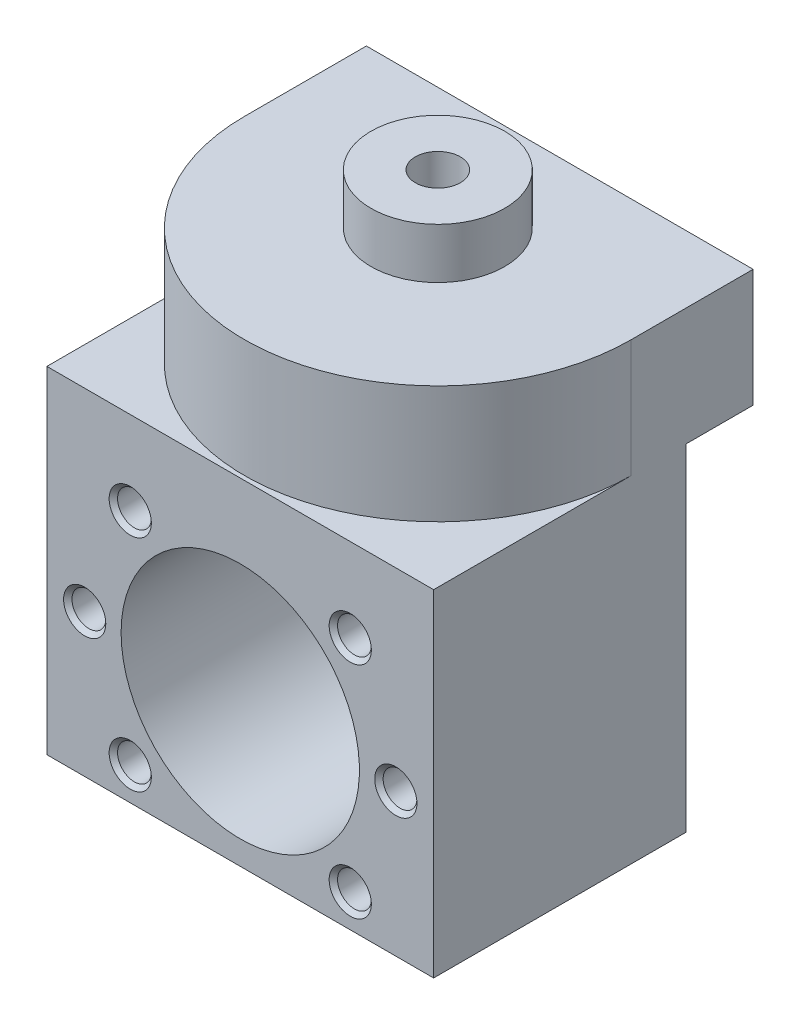
ISO-10303-21;
HEADER;
FILE_DESCRIPTION(('STEP AP214'),'2;1');
FILE_NAME('part.step','',(''),(''),'','','');
FILE_SCHEMA(('AUTOMOTIVE_DESIGN { 1 0 10303 214 1 1 1 1 }'));
ENDSEC;
DATA;
#1=APPLICATION_CONTEXT('core data for automotive mechanical design processes');
#2=APPLICATION_PROTOCOL_DEFINITION('international standard','automotive_design',2000,#1);
#3=PRODUCT_CONTEXT('',#1,'mechanical');
#4=PRODUCT('Part','Part','',(#3));
#5=PRODUCT_RELATED_PRODUCT_CATEGORY('part','',(#4));
#6=PRODUCT_DEFINITION_FORMATION('','',#4);
#7=PRODUCT_DEFINITION_CONTEXT('part definition',#1,'design');
#8=PRODUCT_DEFINITION('design','',#6,#7);
#9=PRODUCT_DEFINITION_SHAPE('','',#8);
#10=(LENGTH_UNIT() NAMED_UNIT(*) SI_UNIT(.MILLI.,.METRE.));
#11=(NAMED_UNIT(*) PLANE_ANGLE_UNIT() SI_UNIT($,.RADIAN.));
#12=(NAMED_UNIT(*) SI_UNIT($,.STERADIAN.) SOLID_ANGLE_UNIT());
#13=UNCERTAINTY_MEASURE_WITH_UNIT(LENGTH_MEASURE(1.E-05),#10,'distance_accuracy_value','');
#14=(GEOMETRIC_REPRESENTATION_CONTEXT(3) GLOBAL_UNCERTAINTY_ASSIGNED_CONTEXT((#13)) GLOBAL_UNIT_ASSIGNED_CONTEXT((#10,
#11,#12)) REPRESENTATION_CONTEXT('',''));
#15=CARTESIAN_POINT('',(0.,0.,0.));
#16=DIRECTION('',(0.,0.,1.));
#17=DIRECTION('',(1.,0.,0.));
#18=AXIS2_PLACEMENT_3D('',#15,#16,#17);
#19=CARTESIAN_POINT('',(0.,68.58,-10.795));
#20=DIRECTION('',(0.,1.,0.));
#21=DIRECTION('',(0.,0.,1.));
#22=AXIS2_PLACEMENT_3D('',#19,#20,#21);
#23=PLANE('',#22);
#24=CARTESIAN_POINT('',(0.,68.58,-10.795));
#25=DIRECTION('',(0.,1.,0.));
#26=DIRECTION('',(0.,0.,1.));
#27=AXIS2_PLACEMENT_3D('',#24,#25,#26);
#28=CIRCLE('',#27,29.21);
#29=CARTESIAN_POINT('',(-29.21,68.58,-10.795));
#30=VERTEX_POINT('',#29);
#31=CARTESIAN_POINT('',(29.21,68.58,-10.795));
#32=VERTEX_POINT('',#31);
#33=EDGE_CURVE('E139',#30,#32,#28,.T.);
#34=ORIENTED_EDGE('',*,*,#33,.T.);
#35=DIRECTION('',(0.,0.,-1.));
#36=VECTOR('',#35,1.);
#37=CARTESIAN_POINT('',(29.21,68.58,-29.21));
#38=LINE('',#37,#36);
#39=CARTESIAN_POINT('',(29.21,68.58,-29.21));
#40=VERTEX_POINT('',#39);
#41=EDGE_CURVE('E141',#32,#40,#38,.T.);
#42=ORIENTED_EDGE('',*,*,#41,.T.);
#43=DIRECTION('',(-1.,0.,0.));
#44=VECTOR('',#43,1.);
#45=CARTESIAN_POINT('',(-29.21,68.58,-29.21));
#46=LINE('',#45,#44);
#47=CARTESIAN_POINT('',(-29.21,68.58,-29.21));
#48=VERTEX_POINT('',#47);
#49=EDGE_CURVE('E144',#40,#48,#46,.T.);
#50=ORIENTED_EDGE('',*,*,#49,.T.);
#51=DIRECTION('',(0.,0.,1.));
#52=VECTOR('',#51,1.);
#53=CARTESIAN_POINT('',(-29.21,68.58,-29.21));
#54=LINE('',#53,#52);
#55=EDGE_CURVE('E146',#48,#30,#54,.T.);
#56=ORIENTED_EDGE('',*,*,#55,.T.);
#57=EDGE_LOOP('',(#34,#42,#50,#56));
#58=FACE_BOUND('',#57,.T.);
#59=CARTESIAN_POINT('',(0.,68.58,-10.795));
#60=DIRECTION('',(0.,1.,0.));
#61=DIRECTION('',(0.,0.,1.));
#62=AXIS2_PLACEMENT_3D('',#59,#60,#61);
#63=CIRCLE('',#62,10.0965);
#64=CARTESIAN_POINT('',(0.,68.58,-20.8915));
#65=VERTEX_POINT('',#64);
#66=EDGE_CURVE('E136',#65,#65,#63,.T.);
#67=ORIENTED_EDGE('',*,*,#66,.F.);
#68=EDGE_LOOP('',(#67));
#69=FACE_BOUND('',#68,.T.);
#70=ADVANCED_FACE('F37',(#58,#69),#23,.T.);
#71=CARTESIAN_POINT('',(29.21,50.8,-19.05));
#72=DIRECTION('',(-1.,0.,0.));
#73=DIRECTION('',(0.,0.,1.));
#74=AXIS2_PLACEMENT_3D('',#71,#72,#73);
#75=PLANE('',#74);
#76=DIRECTION('',(0.,0.,-1.));
#77=VECTOR('',#76,1.);
#78=CARTESIAN_POINT('',(29.21,0.,-19.05));
#79=LINE('',#78,#77);
#80=CARTESIAN_POINT('',(29.21,0.,19.05));
#81=VERTEX_POINT('',#80);
#82=CARTESIAN_POINT('',(29.21,0.,-19.05));
#83=VERTEX_POINT('',#82);
#84=EDGE_CURVE('E163',#81,#83,#79,.T.);
#85=ORIENTED_EDGE('',*,*,#84,.T.);
#86=DIRECTION('',(0.,-1.,0.));
#87=VECTOR('',#86,1.);
#88=CARTESIAN_POINT('',(29.21,50.8,-19.05));
#89=LINE('',#88,#87);
#90=CARTESIAN_POINT('',(29.21,50.8,-19.05));
#91=VERTEX_POINT('',#90);
#92=EDGE_CURVE('E11',#91,#83,#89,.T.);
#93=ORIENTED_EDGE('',*,*,#92,.F.);
#94=DIRECTION('',(0.,0.,-1.));
#95=VECTOR('',#94,1.);
#96=CARTESIAN_POINT('',(29.21,50.8,-29.21));
#97=LINE('',#96,#95);
#98=CARTESIAN_POINT('',(29.21,50.8,-29.21));
#99=VERTEX_POINT('',#98);
#100=EDGE_CURVE('E156',#91,#99,#97,.T.);
#101=ORIENTED_EDGE('',*,*,#100,.T.);
#102=DIRECTION('',(0.,-1.,0.));
#103=VECTOR('',#102,1.);
#104=CARTESIAN_POINT('',(29.21,68.58,-29.21));
#105=LINE('',#104,#103);
#106=EDGE_CURVE('E164',#40,#99,#105,.T.);
#107=ORIENTED_EDGE('',*,*,#106,.F.);
#108=ORIENTED_EDGE('',*,*,#41,.F.);
#109=DIRECTION('',(0.,-1.,0.));
#110=VECTOR('',#109,1.);
#111=CARTESIAN_POINT('',(29.21,68.58,-10.795));
#112=LINE('',#111,#110);
#113=CARTESIAN_POINT('',(29.21,50.8,-10.795));
#114=VERTEX_POINT('',#113);
#115=EDGE_CURVE('E160',#32,#114,#112,.T.);
#116=ORIENTED_EDGE('',*,*,#115,.T.);
#117=DIRECTION('',(0.,0.,-1.));
#118=VECTOR('',#117,1.);
#119=CARTESIAN_POINT('',(29.21,50.8,-19.05));
#120=LINE('',#119,#118);
#121=CARTESIAN_POINT('',(29.21,50.8,19.05));
#122=VERTEX_POINT('',#121);
#123=EDGE_CURVE('E174',#122,#114,#120,.T.);
#124=ORIENTED_EDGE('',*,*,#123,.F.);
#125=DIRECTION('',(0.,-1.,0.));
#126=VECTOR('',#125,1.);
#127=CARTESIAN_POINT('',(29.21,50.8,19.05));
#128=LINE('',#127,#126);
#129=EDGE_CURVE('E183',#122,#81,#128,.T.);
#130=ORIENTED_EDGE('',*,*,#129,.T.);
#131=EDGE_LOOP('',(#85,#93,#101,#107,#108,#116,#124,#130));
#132=FACE_BOUND('',#131,.T.);
#133=ADVANCED_FACE('F39',(#132),#75,.F.);
#134=CARTESIAN_POINT('',(-29.21,50.8,-19.05));
#135=DIRECTION('',(0.,0.,1.));
#136=DIRECTION('',(1.,0.,0.));
#137=AXIS2_PLACEMENT_3D('',#134,#135,#136);
#138=PLANE('',#137);
#139=CARTESIAN_POINT('',(-16.6170093578841,4.97299064211633,-19.05));
#140=DIRECTION('',(0.,0.,-1.));
#141=DIRECTION('',(-1.,0.,0.));
#142=AXIS2_PLACEMENT_3D('',#139,#140,#141);
#143=CIRCLE('',#142,3.1877);
#144=CARTESIAN_POINT('',(-19.8047093578841,4.97299064211633,-19.05));
#145=VERTEX_POINT('',#144);
#146=EDGE_CURVE('E273',#145,#145,#143,.T.);
#147=ORIENTED_EDGE('',*,*,#146,.F.);
#148=EDGE_LOOP('',(#147));
#149=FACE_BOUND('',#148,.T.);
#150=CARTESIAN_POINT('',(16.6170093578837,4.97299064211599,-19.05));
#151=DIRECTION('',(0.,0.,-1.));
#152=DIRECTION('',(-1.,0.,0.));
#153=AXIS2_PLACEMENT_3D('',#150,#151,#152);
#154=CIRCLE('',#153,3.1877);
#155=CARTESIAN_POINT('',(13.4293093578837,4.97299064211599,-19.05));
#156=VERTEX_POINT('',#155);
#157=EDGE_CURVE('E277',#156,#156,#154,.T.);
#158=ORIENTED_EDGE('',*,*,#157,.F.);
#159=EDGE_LOOP('',(#158));
#160=FACE_BOUND('',#159,.T.);
#161=CARTESIAN_POINT('',(23.5,21.59,-19.05));
#162=DIRECTION('',(0.,0.,-1.));
#163=DIRECTION('',(-1.,0.,0.));
#164=AXIS2_PLACEMENT_3D('',#161,#162,#163);
#165=CIRCLE('',#164,3.1877);
#166=CARTESIAN_POINT('',(20.3123,21.59,-19.05));
#167=VERTEX_POINT('',#166);
#168=EDGE_CURVE('E281',#167,#167,#165,.T.);
#169=ORIENTED_EDGE('',*,*,#168,.F.);
#170=EDGE_LOOP('',(#169));
#171=FACE_BOUND('',#170,.T.);
#172=CARTESIAN_POINT('',(16.617009357884,38.2070093578838,-19.05));
#173=DIRECTION('',(0.,0.,-1.));
#174=DIRECTION('',(-1.,0.,0.));
#175=AXIS2_PLACEMENT_3D('',#172,#173,#174);
#176=CIRCLE('',#175,3.1877);
#177=CARTESIAN_POINT('',(13.429309357884,38.2070093578838,-19.05));
#178=VERTEX_POINT('',#177);
#179=EDGE_CURVE('E285',#178,#178,#176,.T.);
#180=ORIENTED_EDGE('',*,*,#179,.F.);
#181=EDGE_LOOP('',(#180));
#182=FACE_BOUND('',#181,.T.);
#183=CARTESIAN_POINT('',(-16.6170093578838,38.2070093578839,-19.05));
#184=DIRECTION('',(0.,0.,-1.));
#185=DIRECTION('',(-1.,0.,0.));
#186=AXIS2_PLACEMENT_3D('',#183,#184,#185);
#187=CIRCLE('',#186,3.1877);
#188=CARTESIAN_POINT('',(-19.8047093578838,38.2070093578839,-19.05));
#189=VERTEX_POINT('',#188);
#190=EDGE_CURVE('E289',#189,#189,#187,.T.);
#191=ORIENTED_EDGE('',*,*,#190,.F.);
#192=EDGE_LOOP('',(#191));
#193=FACE_BOUND('',#192,.T.);
#194=CARTESIAN_POINT('',(-23.5,21.59,-19.05));
#195=DIRECTION('',(0.,0.,-1.));
#196=DIRECTION('',(-1.,0.,0.));
#197=AXIS2_PLACEMENT_3D('',#194,#195,#196);
#198=CIRCLE('',#197,3.1877);
#199=CARTESIAN_POINT('',(-26.6877,21.59,-19.05));
#200=VERTEX_POINT('',#199);
#201=EDGE_CURVE('E293',#200,#200,#198,.T.);
#202=ORIENTED_EDGE('',*,*,#201,.F.);
#203=EDGE_LOOP('',(#202));
#204=FACE_BOUND('',#203,.T.);
#205=CARTESIAN_POINT('',(0.,21.59,-19.05));
#206=DIRECTION('',(0.,0.,-1.));
#207=DIRECTION('',(-1.,0.,0.));
#208=AXIS2_PLACEMENT_3D('',#205,#206,#207);
#209=CIRCLE('',#208,18.);
#210=CARTESIAN_POINT('',(-18.,21.59,-19.05));
#211=VERTEX_POINT('',#210);
#212=EDGE_CURVE('E123',#211,#211,#209,.T.);
#213=ORIENTED_EDGE('',*,*,#212,.F.);
#214=EDGE_LOOP('',(#213));
#215=FACE_BOUND('',#214,.T.);
#216=DIRECTION('',(-1.,0.,0.));
#217=VECTOR('',#216,1.);
#218=CARTESIAN_POINT('',(-29.21,0.,-19.05));
#219=LINE('',#218,#217);
#220=CARTESIAN_POINT('',(-29.21,0.,-19.05));
#221=VERTEX_POINT('',#220);
#222=EDGE_CURVE('E186',#83,#221,#219,.T.);
#223=ORIENTED_EDGE('',*,*,#222,.T.);
#224=DIRECTION('',(0.,-1.,0.));
#225=VECTOR('',#224,1.);
#226=CARTESIAN_POINT('',(-29.21,50.8,-19.05));
#227=LINE('',#226,#225);
#228=CARTESIAN_POINT('',(-29.21,50.8,-19.05));
#229=VERTEX_POINT('',#228);
#230=EDGE_CURVE('E46',#229,#221,#227,.T.);
#231=ORIENTED_EDGE('',*,*,#230,.F.);
#232=DIRECTION('',(-1.,0.,0.));
#233=VECTOR('',#232,1.);
#234=CARTESIAN_POINT('',(-29.21,50.8,-19.05));
#235=LINE('',#234,#233);
#236=EDGE_CURVE('E88',#91,#229,#235,.T.);
#237=ORIENTED_EDGE('',*,*,#236,.F.);
#238=ORIENTED_EDGE('',*,*,#92,.T.);
#239=EDGE_LOOP('',(#223,#231,#237,#238));
#240=FACE_BOUND('',#239,.T.);
#241=ADVANCED_FACE('F219',(#149,#160,#171,#182,#193,#204,#215,#240),#138,.F.);
#242=CARTESIAN_POINT('',(-29.21,50.8,-19.05));
#243=DIRECTION('',(1.,0.,0.));
#244=DIRECTION('',(0.,0.,-1.));
#245=AXIS2_PLACEMENT_3D('',#242,#243,#244);
#246=PLANE('',#245);
#247=DIRECTION('',(0.,0.,1.));
#248=VECTOR('',#247,1.);
#249=CARTESIAN_POINT('',(-29.21,0.,-19.05));
#250=LINE('',#249,#248);
#251=CARTESIAN_POINT('',(-29.21,0.,19.05));
#252=VERTEX_POINT('',#251);
#253=EDGE_CURVE('E188',#221,#252,#250,.T.);
#254=ORIENTED_EDGE('',*,*,#253,.T.);
#255=DIRECTION('',(0.,-1.,0.));
#256=VECTOR('',#255,1.);
#257=CARTESIAN_POINT('',(-29.21,50.8,19.05));
#258=LINE('',#257,#256);
#259=CARTESIAN_POINT('',(-29.21,50.8,19.05));
#260=VERTEX_POINT('',#259);
#261=EDGE_CURVE('E192',#260,#252,#258,.T.);
#262=ORIENTED_EDGE('',*,*,#261,.F.);
#263=DIRECTION('',(0.,0.,1.));
#264=VECTOR('',#263,1.);
#265=CARTESIAN_POINT('',(-29.21,50.8,-19.05));
#266=LINE('',#265,#264);
#267=CARTESIAN_POINT('',(-29.21,50.8,-10.795));
#268=VERTEX_POINT('',#267);
#269=EDGE_CURVE('E157',#268,#260,#266,.T.);
#270=ORIENTED_EDGE('',*,*,#269,.F.);
#271=DIRECTION('',(0.,-1.,0.));
#272=VECTOR('',#271,1.);
#273=CARTESIAN_POINT('',(-29.21,68.58,-10.795));
#274=LINE('',#273,#272);
#275=EDGE_CURVE('E148',#30,#268,#274,.T.);
#276=ORIENTED_EDGE('',*,*,#275,.F.);
#277=ORIENTED_EDGE('',*,*,#55,.F.);
#278=DIRECTION('',(0.,-1.,0.));
#279=VECTOR('',#278,1.);
#280=CARTESIAN_POINT('',(-29.21,68.58,-29.21));
#281=LINE('',#280,#279);
#282=CARTESIAN_POINT('',(-29.21,50.8,-29.21));
#283=VERTEX_POINT('',#282);
#284=EDGE_CURVE('E169',#48,#283,#281,.T.);
#285=ORIENTED_EDGE('',*,*,#284,.T.);
#286=DIRECTION('',(0.,0.,1.));
#287=VECTOR('',#286,1.);
#288=CARTESIAN_POINT('',(-29.21,50.8,-29.21));
#289=LINE('',#288,#287);
#290=EDGE_CURVE('E142',#283,#229,#289,.T.);
#291=ORIENTED_EDGE('',*,*,#290,.T.);
#292=ORIENTED_EDGE('',*,*,#230,.T.);
#293=EDGE_LOOP('',(#254,#262,#270,#276,#277,#285,#291,#292));
#294=FACE_BOUND('',#293,.T.);
#295=ADVANCED_FACE('F211',(#294),#246,.F.);
#296=CARTESIAN_POINT('',(-29.21,50.8,19.05));
#297=DIRECTION('',(0.,0.,-1.));
#298=DIRECTION('',(-1.,0.,0.));
#299=AXIS2_PLACEMENT_3D('',#296,#297,#298);
#300=PLANE('',#299);
#301=CARTESIAN_POINT('',(-16.6170093578841,4.97299064211633,19.05));
#302=DIRECTION('',(0.,0.,1.));
#303=DIRECTION('',(1.,0.,0.));
#304=AXIS2_PLACEMENT_3D('',#301,#302,#303);
#305=CIRCLE('',#304,3.1877);
#306=CARTESIAN_POINT('',(-13.4293093578841,4.97299064211633,19.05));
#307=VERTEX_POINT('',#306);
#308=EDGE_CURVE('E388',#307,#307,#305,.T.);
#309=ORIENTED_EDGE('',*,*,#308,.F.);
#310=EDGE_LOOP('',(#309));
#311=FACE_BOUND('',#310,.T.);
#312=CARTESIAN_POINT('',(16.6170093578837,4.97299064211599,19.05));
#313=DIRECTION('',(0.,0.,1.));
#314=DIRECTION('',(1.,0.,0.));
#315=AXIS2_PLACEMENT_3D('',#312,#313,#314);
#316=CIRCLE('',#315,3.1877);
#317=CARTESIAN_POINT('',(19.8047093578837,4.97299064211599,19.05));
#318=VERTEX_POINT('',#317);
#319=EDGE_CURVE('E390',#318,#318,#316,.T.);
#320=ORIENTED_EDGE('',*,*,#319,.F.);
#321=EDGE_LOOP('',(#320));
#322=FACE_BOUND('',#321,.T.);
#323=CARTESIAN_POINT('',(23.5,21.59,19.05));
#324=DIRECTION('',(0.,0.,1.));
#325=DIRECTION('',(1.,0.,0.));
#326=AXIS2_PLACEMENT_3D('',#323,#324,#325);
#327=CIRCLE('',#326,3.1877);
#328=CARTESIAN_POINT('',(26.6877,21.59,19.05));
#329=VERTEX_POINT('',#328);
#330=EDGE_CURVE('E398',#329,#329,#327,.T.);
#331=ORIENTED_EDGE('',*,*,#330,.F.);
#332=EDGE_LOOP('',(#331));
#333=FACE_BOUND('',#332,.T.);
#334=CARTESIAN_POINT('',(16.617009357884,38.2070093578838,19.05));
#335=DIRECTION('',(0.,0.,1.));
#336=DIRECTION('',(1.,0.,0.));
#337=AXIS2_PLACEMENT_3D('',#334,#335,#336);
#338=CIRCLE('',#337,3.1877);
#339=CARTESIAN_POINT('',(19.804709357884,38.2070093578838,19.05));
#340=VERTEX_POINT('',#339);
#341=EDGE_CURVE('E404',#340,#340,#338,.T.);
#342=ORIENTED_EDGE('',*,*,#341,.F.);
#343=EDGE_LOOP('',(#342));
#344=FACE_BOUND('',#343,.T.);
#345=CARTESIAN_POINT('',(-16.6170093578838,38.2070093578839,19.05));
#346=DIRECTION('',(0.,0.,1.));
#347=DIRECTION('',(1.,0.,0.));
#348=AXIS2_PLACEMENT_3D('',#345,#346,#347);
#349=CIRCLE('',#348,3.1877);
#350=CARTESIAN_POINT('',(-13.4293093578838,38.2070093578839,19.05));
#351=VERTEX_POINT('',#350);
#352=EDGE_CURVE('E410',#351,#351,#349,.T.);
#353=ORIENTED_EDGE('',*,*,#352,.F.);
#354=EDGE_LOOP('',(#353));
#355=FACE_BOUND('',#354,.T.);
#356=CARTESIAN_POINT('',(-23.5,21.59,19.05));
#357=DIRECTION('',(0.,0.,1.));
#358=DIRECTION('',(1.,0.,0.));
#359=AXIS2_PLACEMENT_3D('',#356,#357,#358);
#360=CIRCLE('',#359,3.1877);
#361=CARTESIAN_POINT('',(-20.3123,21.59,19.05));
#362=VERTEX_POINT('',#361);
#363=EDGE_CURVE('E416',#362,#362,#360,.T.);
#364=ORIENTED_EDGE('',*,*,#363,.F.);
#365=EDGE_LOOP('',(#364));
#366=FACE_BOUND('',#365,.T.);
#367=CARTESIAN_POINT('',(0.,21.59,19.05));
#368=DIRECTION('',(0.,0.,-1.));
#369=DIRECTION('',(-1.,0.,0.));
#370=AXIS2_PLACEMENT_3D('',#367,#368,#369);
#371=CIRCLE('',#370,18.);
#372=CARTESIAN_POINT('',(-18.,21.59,19.05));
#373=VERTEX_POINT('',#372);
#374=EDGE_CURVE('E41',#373,#373,#371,.T.);
#375=ORIENTED_EDGE('',*,*,#374,.T.);
#376=EDGE_LOOP('',(#375));
#377=FACE_BOUND('',#376,.T.);
#378=DIRECTION('',(1.,0.,0.));
#379=VECTOR('',#378,1.);
#380=CARTESIAN_POINT('',(-29.21,0.,19.05));
#381=LINE('',#380,#379);
#382=EDGE_CURVE('E81',#252,#81,#381,.T.);
#383=ORIENTED_EDGE('',*,*,#382,.T.);
#384=ORIENTED_EDGE('',*,*,#129,.F.);
#385=DIRECTION('',(1.,0.,0.));
#386=VECTOR('',#385,1.);
#387=CARTESIAN_POINT('',(-29.21,50.8,19.05));
#388=LINE('',#387,#386);
#389=EDGE_CURVE('E60',#260,#122,#388,.T.);
#390=ORIENTED_EDGE('',*,*,#389,.F.);
#391=ORIENTED_EDGE('',*,*,#261,.T.);
#392=EDGE_LOOP('',(#383,#384,#390,#391));
#393=FACE_BOUND('',#392,.T.);
#394=ADVANCED_FACE('F215',(#311,#322,#333,#344,#355,#366,#377,#393),#300,.F.);
#395=CARTESIAN_POINT('',(29.21,50.8,19.05));
#396=DIRECTION('',(0.,1.,0.));
#397=DIRECTION('',(0.,0.,1.));
#398=AXIS2_PLACEMENT_3D('',#395,#396,#397);
#399=PLANE('',#398);
#400=CARTESIAN_POINT('',(0.,50.8,-10.795));
#401=DIRECTION('',(0.,1.,0.));
#402=DIRECTION('',(0.,0.,1.));
#403=AXIS2_PLACEMENT_3D('',#400,#401,#402);
#404=CIRCLE('',#403,29.21);
#405=EDGE_CURVE('E54',#268,#114,#404,.T.);
#406=ORIENTED_EDGE('',*,*,#405,.F.);
#407=ORIENTED_EDGE('',*,*,#269,.T.);
#408=ORIENTED_EDGE('',*,*,#389,.T.);
#409=ORIENTED_EDGE('',*,*,#123,.T.);
#410=EDGE_LOOP('',(#406,#407,#408,#409));
#411=FACE_BOUND('',#410,.T.);
#412=ADVANCED_FACE('F194',(#411),#399,.T.);
#413=CARTESIAN_POINT('',(29.21,0.,19.05));
#414=DIRECTION('',(0.,1.,0.));
#415=DIRECTION('',(0.,0.,1.));
#416=AXIS2_PLACEMENT_3D('',#413,#414,#415);
#417=PLANE('',#416);
#418=ORIENTED_EDGE('',*,*,#84,.F.);
#419=ORIENTED_EDGE('',*,*,#382,.F.);
#420=ORIENTED_EDGE('',*,*,#253,.F.);
#421=ORIENTED_EDGE('',*,*,#222,.F.);
#422=EDGE_LOOP('',(#418,#419,#420,#421));
#423=FACE_BOUND('',#422,.T.);
#424=ADVANCED_FACE('F218',(#423),#417,.F.);
#425=CARTESIAN_POINT('',(0.,50.8,-10.795));
#426=DIRECTION('',(0.,1.,0.));
#427=DIRECTION('',(0.,0.,1.));
#428=AXIS2_PLACEMENT_3D('',#425,#426,#427);
#429=PLANE('',#428);
#430=ORIENTED_EDGE('',*,*,#100,.F.);
#431=ORIENTED_EDGE('',*,*,#236,.T.);
#432=ORIENTED_EDGE('',*,*,#290,.F.);
#433=DIRECTION('',(-1.,0.,0.));
#434=VECTOR('',#433,1.);
#435=CARTESIAN_POINT('',(-29.21,50.8,-29.21));
#436=LINE('',#435,#434);
#437=EDGE_CURVE('E226',#99,#283,#436,.T.);
#438=ORIENTED_EDGE('',*,*,#437,.F.);
#439=EDGE_LOOP('',(#430,#431,#432,#438));
#440=FACE_BOUND('',#439,.T.);
#441=ADVANCED_FACE('F223',(#440),#429,.F.);
#442=CARTESIAN_POINT('',(0.,68.58,-10.795));
#443=DIRECTION('',(0.,-1.,0.));
#444=DIRECTION('',(0.,0.,-1.));
#445=AXIS2_PLACEMENT_3D('',#442,#443,#444);
#446=CYLINDRICAL_SURFACE('',#445,29.21);
#447=ORIENTED_EDGE('',*,*,#405,.T.);
#448=ORIENTED_EDGE('',*,*,#115,.F.);
#449=ORIENTED_EDGE('',*,*,#33,.F.);
#450=ORIENTED_EDGE('',*,*,#275,.T.);
#451=EDGE_LOOP('',(#447,#448,#449,#450));
#452=FACE_BOUND('',#451,.T.);
#453=ADVANCED_FACE('F198',(#452),#446,.T.);
#454=CARTESIAN_POINT('',(-29.21,68.58,-29.21));
#455=DIRECTION('',(0.,0.,1.));
#456=DIRECTION('',(1.,0.,0.));
#457=AXIS2_PLACEMENT_3D('',#454,#455,#456);
#458=PLANE('',#457);
#459=ORIENTED_EDGE('',*,*,#437,.T.);
#460=ORIENTED_EDGE('',*,*,#284,.F.);
#461=ORIENTED_EDGE('',*,*,#49,.F.);
#462=ORIENTED_EDGE('',*,*,#106,.T.);
#463=EDGE_LOOP('',(#459,#460,#461,#462));
#464=FACE_BOUND('',#463,.T.);
#465=ADVANCED_FACE('F233',(#464),#458,.F.);
#466=CARTESIAN_POINT('',(0.,76.2,-10.795));
#467=DIRECTION('',(0.,-1.,0.));
#468=DIRECTION('',(0.,0.,-1.));
#469=AXIS2_PLACEMENT_3D('',#466,#467,#468);
#470=CYLINDRICAL_SURFACE('',#469,10.0965);
#471=CARTESIAN_POINT('',(0.,76.2,-10.795));
#472=DIRECTION('',(0.,1.,0.));
#473=DIRECTION('',(0.,0.,1.));
#474=AXIS2_PLACEMENT_3D('',#471,#472,#473);
#475=CIRCLE('',#474,10.0965);
#476=CARTESIAN_POINT('',(0.,76.2,-20.8915));
#477=VERTEX_POINT('',#476);
#478=EDGE_CURVE('E133',#477,#477,#475,.T.);
#479=CARTESIAN_POINT('',(0.,76.2,-20.8915));
#480=CARTESIAN_POINT('',(0.,76.120625,-20.8915));
#481=CARTESIAN_POINT('',(0.,76.04125,-20.8915));
#482=CARTESIAN_POINT('',(0.,75.8825,-20.8915));
#483=CARTESIAN_POINT('',(0.,75.803125,-20.8915));
#484=CARTESIAN_POINT('',(0.,75.644375,-20.8915));
#485=CARTESIAN_POINT('',(0.,75.565,-20.8915));
#486=CARTESIAN_POINT('',(0.,75.40625,-20.8915));
#487=CARTESIAN_POINT('',(0.,75.326875,-20.8915));
#488=CARTESIAN_POINT('',(0.,75.168125,-20.8915));
#489=CARTESIAN_POINT('',(0.,75.08875,-20.8915));
#490=CARTESIAN_POINT('',(0.,74.93,-20.8915));
#491=CARTESIAN_POINT('',(0.,74.850625,-20.8915));
#492=CARTESIAN_POINT('',(0.,74.691875,-20.8915));
#493=CARTESIAN_POINT('',(0.,74.6125,-20.8915));
#494=CARTESIAN_POINT('',(0.,74.45375,-20.8915));
#495=CARTESIAN_POINT('',(0.,74.374375,-20.8915));
#496=CARTESIAN_POINT('',(0.,74.215625,-20.8915));
#497=CARTESIAN_POINT('',(0.,74.13625,-20.8915));
#498=CARTESIAN_POINT('',(0.,73.9775,-20.8915));
#499=CARTESIAN_POINT('',(0.,73.898125,-20.8915));
#500=CARTESIAN_POINT('',(0.,73.739375,-20.8915));
#501=CARTESIAN_POINT('',(0.,73.66,-20.8915));
#502=CARTESIAN_POINT('',(0.,73.50125,-20.8915));
#503=CARTESIAN_POINT('',(0.,73.421875,-20.8915));
#504=CARTESIAN_POINT('',(0.,73.263125,-20.8915));
#505=CARTESIAN_POINT('',(0.,73.18375,-20.8915));
#506=CARTESIAN_POINT('',(0.,73.025,-20.8915));
#507=CARTESIAN_POINT('',(0.,72.945625,-20.8915));
#508=CARTESIAN_POINT('',(0.,72.786875,-20.8915));
#509=CARTESIAN_POINT('',(0.,72.7075,-20.8915));
#510=CARTESIAN_POINT('',(0.,72.54875,-20.8915));
#511=CARTESIAN_POINT('',(0.,72.469375,-20.8915));
#512=CARTESIAN_POINT('',(0.,72.310625,-20.8915));
#513=CARTESIAN_POINT('',(0.,72.23125,-20.8915));
#514=CARTESIAN_POINT('',(0.,72.0725,-20.8915));
#515=CARTESIAN_POINT('',(0.,71.993125,-20.8915));
#516=CARTESIAN_POINT('',(0.,71.834375,-20.8915));
#517=CARTESIAN_POINT('',(0.,71.755,-20.8915));
#518=CARTESIAN_POINT('',(0.,71.59625,-20.8915));
#519=CARTESIAN_POINT('',(0.,71.516875,-20.8915));
#520=CARTESIAN_POINT('',(0.,71.358125,-20.8915));
#521=CARTESIAN_POINT('',(0.,71.27875,-20.8915));
#522=CARTESIAN_POINT('',(0.,71.12,-20.8915));
#523=CARTESIAN_POINT('',(0.,71.040625,-20.8915));
#524=CARTESIAN_POINT('',(0.,70.881875,-20.8915));
#525=CARTESIAN_POINT('',(0.,70.8025,-20.8915));
#526=CARTESIAN_POINT('',(0.,70.64375,-20.8915));
#527=CARTESIAN_POINT('',(0.,70.564375,-20.8915));
#528=CARTESIAN_POINT('',(0.,70.405625,-20.8915));
#529=CARTESIAN_POINT('',(0.,70.32625,-20.8915));
#530=CARTESIAN_POINT('',(0.,70.1675,-20.8915));
#531=CARTESIAN_POINT('',(0.,70.088125,-20.8915));
#532=CARTESIAN_POINT('',(0.,69.929375,-20.8915));
#533=CARTESIAN_POINT('',(0.,69.85,-20.8915));
#534=CARTESIAN_POINT('',(0.,69.69125,-20.8915));
#535=CARTESIAN_POINT('',(0.,69.611875,-20.8915));
#536=CARTESIAN_POINT('',(0.,69.453125,-20.8915));
#537=CARTESIAN_POINT('',(0.,69.37375,-20.8915));
#538=CARTESIAN_POINT('',(0.,69.215,-20.8915));
#539=CARTESIAN_POINT('',(0.,69.135625,-20.8915));
#540=CARTESIAN_POINT('',(0.,68.976875,-20.8915));
#541=CARTESIAN_POINT('',(0.,68.8975,-20.8915));
#542=CARTESIAN_POINT('',(0.,68.73875,-20.8915));
#543=CARTESIAN_POINT('',(0.,68.659375,-20.8915));
#544=CARTESIAN_POINT('',(0.,68.58,-20.8915));
#545=B_SPLINE_CURVE_WITH_KNOTS('',3,(#479,#480,#481,#482,#483,#484,#485,#486,#487,#488,#489,
#490,#491,#492,#493,#494,#495,#496,#497,#498,#499,#500,#501,#502,#503,#504,#505,#506,#507,#508,
#509,#510,#511,#512,#513,#514,#515,#516,#517,#518,#519,#520,#521,#522,#523,#524,#525,#526,#527,
#528,#529,#530,#531,#532,#533,#534,#535,#536,#537,#538,#539,#540,#541,#542,#543,#544),
.UNSPECIFIED.,.F.,.F.,(4,2,2,2,2,2,2,2,2,2,2,2,2,2,2,2,2,2,2,2,2,2,2,2,2,2,2,2,2,2,2,2,4),(0.,
0.238125000000006,0.476250000000011,0.714375000000003,0.952500000000009,1.190625,
1.42875000000001,1.66687500000001,1.905,2.14312500000001,2.38125,2.61937500000001,
2.85750000000001,3.095625,3.33375000000001,3.571875,3.81000000000001,4.04812500000001,
4.28625000000001,4.52437500000001,4.7625,5.00062500000001,5.23875000000001,5.47687500000001,
5.71500000000001,5.953125,6.19125000000001,6.42937500000001,6.66750000000001,6.90562500000001,
7.14375,7.38187500000001,7.62000000000002),.UNSPECIFIED.);
#546=EDGE_CURVE('BSEAM235',#477,#65,#545,.T.);
#547=ORIENTED_EDGE('',*,*,#478,.F.);
#548=ORIENTED_EDGE('',*,*,#66,.T.);
#549=ORIENTED_EDGE('',*,*,#546,.T.);
#550=ORIENTED_EDGE('',*,*,#546,.F.);
#551=EDGE_LOOP('',(#547,#549,#548,#550));
#552=FACE_BOUND('',#551,.T.);
#553=ADVANCED_FACE('F235',(#552),#470,.T.);
#554=CARTESIAN_POINT('',(0.,76.2,-10.795));
#555=DIRECTION('',(0.,1.,0.));
#556=DIRECTION('',(0.,0.,1.));
#557=AXIS2_PLACEMENT_3D('',#554,#555,#556);
#558=PLANE('',#557);
#559=CARTESIAN_POINT('',(0.,76.2,-10.795));
#560=DIRECTION('',(0.,1.,0.));
#561=DIRECTION('',(0.,0.,1.));
#562=AXIS2_PLACEMENT_3D('',#559,#560,#561);
#563=CIRCLE('',#562,3.39999999999999);
#564=CARTESIAN_POINT('',(0.,76.2,-7.39500000000002));
#565=VERTEX_POINT('',#564);
#566=EDGE_CURVE('E124',#565,#565,#563,.T.);
#567=ORIENTED_EDGE('',*,*,#566,.F.);
#568=EDGE_LOOP('',(#567));
#569=FACE_BOUND('',#568,.T.);
#570=ORIENTED_EDGE('',*,*,#478,.T.);
#571=EDGE_LOOP('',(#570));
#572=FACE_BOUND('',#571,.T.);
#573=ADVANCED_FACE('F241',(#569,#572),#558,.T.);
#574=CARTESIAN_POINT('',(0.,21.59,19.050025));
#575=DIRECTION('',(0.,0.,-1.));
#576=DIRECTION('',(-1.,0.,0.));
#577=AXIS2_PLACEMENT_3D('',#574,#575,#576);
#578=CYLINDRICAL_SURFACE('',#577,18.);
#579=ORIENTED_EDGE('',*,*,#212,.T.);
#580=EDGE_LOOP('',(#579));
#581=FACE_BOUND('',#580,.T.);
#582=ORIENTED_EDGE('',*,*,#374,.F.);
#583=EDGE_LOOP('',(#582));
#584=FACE_BOUND('',#583,.T.);
#585=ADVANCED_FACE('F117',(#581,#584),#578,.F.);
#586=CARTESIAN_POINT('',(0.,50.8,-10.795));
#587=DIRECTION('',(0.,1.,0.));
#588=DIRECTION('',(0.,0.,1.));
#589=AXIS2_PLACEMENT_3D('',#586,#587,#588);
#590=CONICAL_SURFACE('',#589,3.39999999999999,1.02974425867665);
#591=CARTESIAN_POINT('',(0.,48.7570738953063,-10.795));
#592=VERTEX_POINT('',#591);
#593=VERTEX_LOOP('',#592);
#594=FACE_BOUND('',#593,.T.);
#595=CARTESIAN_POINT('',(0.,50.8,-10.795));
#596=DIRECTION('',(0.,1.,0.));
#597=DIRECTION('',(0.,0.,1.));
#598=AXIS2_PLACEMENT_3D('',#595,#596,#597);
#599=CIRCLE('',#598,3.39999999999999);
#600=CARTESIAN_POINT('',(0.,50.8,-7.39500000000001));
#601=VERTEX_POINT('',#600);
#602=EDGE_CURVE('E121',#601,#601,#599,.T.);
#603=ORIENTED_EDGE('',*,*,#602,.T.);
#604=EDGE_LOOP('',(#603));
#605=FACE_BOUND('',#604,.T.);
#606=ADVANCED_FACE('F113',(#594,#605),#590,.F.);
#607=CARTESIAN_POINT('',(0.,76.2,-10.795));
#608=DIRECTION('',(0.,1.,0.));
#609=DIRECTION('',(0.,0.,1.));
#610=AXIS2_PLACEMENT_3D('',#607,#608,#609);
#611=CYLINDRICAL_SURFACE('',#610,3.39999999999999);
#612=ORIENTED_EDGE('',*,*,#602,.F.);
#613=EDGE_LOOP('',(#612));
#614=FACE_BOUND('',#613,.T.);
#615=ORIENTED_EDGE('',*,*,#566,.T.);
#616=EDGE_LOOP('',(#615));
#617=FACE_BOUND('',#616,.T.);
#618=ADVANCED_FACE('F116',(#614,#617),#611,.F.);
#619=CARTESIAN_POINT('',(-23.5,21.59,-19.05));
#620=DIRECTION('',(0.,0.,-1.));
#621=DIRECTION('',(-1.,0.,0.));
#622=AXIS2_PLACEMENT_3D('',#619,#620,#621);
#623=CYLINDRICAL_SURFACE('',#622,2.5527);
#624=CARTESIAN_POINT('',(-23.5,21.59,-18.415));
#625=DIRECTION('',(0.,0.,-1.));
#626=DIRECTION('',(-1.,0.,0.));
#627=AXIS2_PLACEMENT_3D('',#624,#625,#626);
#628=CIRCLE('',#627,2.5527);
#629=CARTESIAN_POINT('',(-26.0527,21.59,-18.415));
#630=VERTEX_POINT('',#629);
#631=EDGE_CURVE('E129',#630,#630,#628,.T.);
#632=ORIENTED_EDGE('',*,*,#631,.T.);
#633=EDGE_LOOP('',(#632));
#634=FACE_BOUND('',#633,.T.);
#635=CARTESIAN_POINT('',(-23.5,21.59,18.415));
#636=DIRECTION('',(0.,0.,1.));
#637=DIRECTION('',(1.,0.,0.));
#638=AXIS2_PLACEMENT_3D('',#635,#636,#637);
#639=CIRCLE('',#638,2.5527);
#640=CARTESIAN_POINT('',(-20.9473,21.59,18.415));
#641=VERTEX_POINT('',#640);
#642=EDGE_CURVE('E419',#641,#641,#639,.T.);
#643=ORIENTED_EDGE('',*,*,#642,.T.);
#644=EDGE_LOOP('',(#643));
#645=FACE_BOUND('',#644,.T.);
#646=ADVANCED_FACE('F309',(#634,#645),#623,.F.);
#647=CARTESIAN_POINT('',(-23.5,21.59,-19.05));
#648=DIRECTION('',(0.,0.,-1.));
#649=DIRECTION('',(-1.,0.,0.));
#650=AXIS2_PLACEMENT_3D('',#647,#648,#649);
#651=CONICAL_SURFACE('',#650,3.1877,0.785398163397443);
#652=ORIENTED_EDGE('',*,*,#631,.F.);
#653=EDGE_LOOP('',(#652));
#654=FACE_BOUND('',#653,.T.);
#655=ORIENTED_EDGE('',*,*,#201,.T.);
#656=EDGE_LOOP('',(#655));
#657=FACE_BOUND('',#656,.T.);
#658=ADVANCED_FACE('F312',(#654,#657),#651,.F.);
#659=CARTESIAN_POINT('',(-16.6170093578838,38.2070093578839,-19.05));
#660=DIRECTION('',(0.,0.,-1.));
#661=DIRECTION('',(-1.,0.,0.));
#662=AXIS2_PLACEMENT_3D('',#659,#660,#661);
#663=CYLINDRICAL_SURFACE('',#662,2.5527);
#664=CARTESIAN_POINT('',(-16.6170093578838,38.2070093578839,-18.415));
#665=DIRECTION('',(0.,0.,-1.));
#666=DIRECTION('',(-1.,0.,0.));
#667=AXIS2_PLACEMENT_3D('',#664,#665,#666);
#668=CIRCLE('',#667,2.5527);
#669=CARTESIAN_POINT('',(-19.1697093578838,38.2070093578839,-18.415));
#670=VERTEX_POINT('',#669);
#671=EDGE_CURVE('E439',#670,#670,#668,.T.);
#672=ORIENTED_EDGE('',*,*,#671,.T.);
#673=EDGE_LOOP('',(#672));
#674=FACE_BOUND('',#673,.T.);
#675=CARTESIAN_POINT('',(-16.6170093578838,38.2070093578839,18.415));
#676=DIRECTION('',(0.,0.,1.));
#677=DIRECTION('',(1.,0.,0.));
#678=AXIS2_PLACEMENT_3D('',#675,#676,#677);
#679=CIRCLE('',#678,2.5527);
#680=CARTESIAN_POINT('',(-14.0643093578838,38.2070093578839,18.415));
#681=VERTEX_POINT('',#680);
#682=EDGE_CURVE('E413',#681,#681,#679,.T.);
#683=ORIENTED_EDGE('',*,*,#682,.T.);
#684=EDGE_LOOP('',(#683));
#685=FACE_BOUND('',#684,.T.);
#686=ADVANCED_FACE('F316',(#674,#685),#663,.F.);
#687=CARTESIAN_POINT('',(-16.6170093578838,38.2070093578839,-19.05));
#688=DIRECTION('',(0.,0.,-1.));
#689=DIRECTION('',(-1.,0.,0.));
#690=AXIS2_PLACEMENT_3D('',#687,#688,#689);
#691=CONICAL_SURFACE('',#690,3.1877,0.785398163397444);
#692=ORIENTED_EDGE('',*,*,#671,.F.);
#693=EDGE_LOOP('',(#692));
#694=FACE_BOUND('',#693,.T.);
#695=ORIENTED_EDGE('',*,*,#190,.T.);
#696=EDGE_LOOP('',(#695));
#697=FACE_BOUND('',#696,.T.);
#698=ADVANCED_FACE('F320',(#694,#697),#691,.F.);
#699=CARTESIAN_POINT('',(16.617009357884,38.2070093578838,-19.05));
#700=DIRECTION('',(0.,0.,-1.));
#701=DIRECTION('',(-1.,0.,0.));
#702=AXIS2_PLACEMENT_3D('',#699,#700,#701);
#703=CYLINDRICAL_SURFACE('',#702,2.5527);
#704=CARTESIAN_POINT('',(16.617009357884,38.2070093578838,-18.415));
#705=DIRECTION('',(0.,0.,-1.));
#706=DIRECTION('',(-1.,0.,0.));
#707=AXIS2_PLACEMENT_3D('',#704,#705,#706);
#708=CIRCLE('',#707,2.5527);
#709=CARTESIAN_POINT('',(14.064309357884,38.2070093578838,-18.415));
#710=VERTEX_POINT('',#709);
#711=EDGE_CURVE('E435',#710,#710,#708,.T.);
#712=ORIENTED_EDGE('',*,*,#711,.T.);
#713=EDGE_LOOP('',(#712));
#714=FACE_BOUND('',#713,.T.);
#715=CARTESIAN_POINT('',(16.617009357884,38.2070093578838,18.415));
#716=DIRECTION('',(0.,0.,1.));
#717=DIRECTION('',(1.,0.,0.));
#718=AXIS2_PLACEMENT_3D('',#715,#716,#717);
#719=CIRCLE('',#718,2.5527);
#720=CARTESIAN_POINT('',(19.169709357884,38.2070093578838,18.415));
#721=VERTEX_POINT('',#720);
#722=EDGE_CURVE('E407',#721,#721,#719,.T.);
#723=ORIENTED_EDGE('',*,*,#722,.T.);
#724=EDGE_LOOP('',(#723));
#725=FACE_BOUND('',#724,.T.);
#726=ADVANCED_FACE('F324',(#714,#725),#703,.F.);
#727=CARTESIAN_POINT('',(16.617009357884,38.2070093578838,-19.05));
#728=DIRECTION('',(0.,0.,-1.));
#729=DIRECTION('',(-1.,0.,0.));
#730=AXIS2_PLACEMENT_3D('',#727,#728,#729);
#731=CONICAL_SURFACE('',#730,3.1877,0.785398163397446);
#732=ORIENTED_EDGE('',*,*,#711,.F.);
#733=EDGE_LOOP('',(#732));
#734=FACE_BOUND('',#733,.T.);
#735=ORIENTED_EDGE('',*,*,#179,.T.);
#736=EDGE_LOOP('',(#735));
#737=FACE_BOUND('',#736,.T.);
#738=ADVANCED_FACE('F328',(#734,#737),#731,.F.);
#739=CARTESIAN_POINT('',(23.5,21.59,-19.05));
#740=DIRECTION('',(0.,0.,-1.));
#741=DIRECTION('',(-1.,0.,0.));
#742=AXIS2_PLACEMENT_3D('',#739,#740,#741);
#743=CYLINDRICAL_SURFACE('',#742,2.5527);
#744=CARTESIAN_POINT('',(23.5,21.59,-18.415));
#745=DIRECTION('',(0.,0.,-1.));
#746=DIRECTION('',(-1.,0.,0.));
#747=AXIS2_PLACEMENT_3D('',#744,#745,#746);
#748=CIRCLE('',#747,2.5527);
#749=CARTESIAN_POINT('',(20.9473,21.59,-18.415));
#750=VERTEX_POINT('',#749);
#751=EDGE_CURVE('E431',#750,#750,#748,.T.);
#752=ORIENTED_EDGE('',*,*,#751,.T.);
#753=EDGE_LOOP('',(#752));
#754=FACE_BOUND('',#753,.T.);
#755=CARTESIAN_POINT('',(23.5,21.59,18.415));
#756=DIRECTION('',(0.,0.,1.));
#757=DIRECTION('',(1.,0.,0.));
#758=AXIS2_PLACEMENT_3D('',#755,#756,#757);
#759=CIRCLE('',#758,2.5527);
#760=CARTESIAN_POINT('',(26.0527,21.59,18.415));
#761=VERTEX_POINT('',#760);
#762=EDGE_CURVE('E401',#761,#761,#759,.T.);
#763=ORIENTED_EDGE('',*,*,#762,.T.);
#764=EDGE_LOOP('',(#763));
#765=FACE_BOUND('',#764,.T.);
#766=ADVANCED_FACE('F332',(#754,#765),#743,.F.);
#767=CARTESIAN_POINT('',(23.5,21.59,-19.05));
#768=DIRECTION('',(0.,0.,-1.));
#769=DIRECTION('',(-1.,0.,0.));
#770=AXIS2_PLACEMENT_3D('',#767,#768,#769);
#771=CONICAL_SURFACE('',#770,3.1877,0.785398163397443);
#772=ORIENTED_EDGE('',*,*,#751,.F.);
#773=EDGE_LOOP('',(#772));
#774=FACE_BOUND('',#773,.T.);
#775=ORIENTED_EDGE('',*,*,#168,.T.);
#776=EDGE_LOOP('',(#775));
#777=FACE_BOUND('',#776,.T.);
#778=ADVANCED_FACE('F336',(#774,#777),#771,.F.);
#779=CARTESIAN_POINT('',(16.6170093578837,4.97299064211599,-19.05));
#780=DIRECTION('',(0.,0.,-1.));
#781=DIRECTION('',(-1.,0.,0.));
#782=AXIS2_PLACEMENT_3D('',#779,#780,#781);
#783=CYLINDRICAL_SURFACE('',#782,2.5527);
#784=CARTESIAN_POINT('',(16.6170093578837,4.97299064211599,-18.415));
#785=DIRECTION('',(0.,0.,-1.));
#786=DIRECTION('',(-1.,0.,0.));
#787=AXIS2_PLACEMENT_3D('',#784,#785,#786);
#788=CIRCLE('',#787,2.5527);
#789=CARTESIAN_POINT('',(14.0643093578837,4.97299064211599,-18.415));
#790=VERTEX_POINT('',#789);
#791=EDGE_CURVE('E427',#790,#790,#788,.T.);
#792=ORIENTED_EDGE('',*,*,#791,.T.);
#793=EDGE_LOOP('',(#792));
#794=FACE_BOUND('',#793,.T.);
#795=CARTESIAN_POINT('',(16.6170093578837,4.97299064211599,18.415));
#796=DIRECTION('',(0.,0.,1.));
#797=DIRECTION('',(1.,0.,0.));
#798=AXIS2_PLACEMENT_3D('',#795,#796,#797);
#799=CIRCLE('',#798,2.5527);
#800=CARTESIAN_POINT('',(19.1697093578837,4.97299064211599,18.415));
#801=VERTEX_POINT('',#800);
#802=EDGE_CURVE('E395',#801,#801,#799,.T.);
#803=ORIENTED_EDGE('',*,*,#802,.T.);
#804=EDGE_LOOP('',(#803));
#805=FACE_BOUND('',#804,.T.);
#806=ADVANCED_FACE('F340',(#794,#805),#783,.F.);
#807=CARTESIAN_POINT('',(16.6170093578837,4.97299064211599,-19.05));
#808=DIRECTION('',(0.,0.,-1.));
#809=DIRECTION('',(-1.,0.,0.));
#810=AXIS2_PLACEMENT_3D('',#807,#808,#809);
#811=CONICAL_SURFACE('',#810,3.1877,0.785398163397446);
#812=ORIENTED_EDGE('',*,*,#791,.F.);
#813=EDGE_LOOP('',(#812));
#814=FACE_BOUND('',#813,.T.);
#815=ORIENTED_EDGE('',*,*,#157,.T.);
#816=EDGE_LOOP('',(#815));
#817=FACE_BOUND('',#816,.T.);
#818=ADVANCED_FACE('F344',(#814,#817),#811,.F.);
#819=CARTESIAN_POINT('',(-16.6170093578841,4.97299064211633,-19.05));
#820=DIRECTION('',(0.,0.,-1.));
#821=DIRECTION('',(-1.,0.,0.));
#822=AXIS2_PLACEMENT_3D('',#819,#820,#821);
#823=CYLINDRICAL_SURFACE('',#822,2.5527);
#824=CARTESIAN_POINT('',(-16.6170093578841,4.97299064211633,-18.415));
#825=DIRECTION('',(0.,0.,-1.));
#826=DIRECTION('',(-1.,0.,0.));
#827=AXIS2_PLACEMENT_3D('',#824,#825,#826);
#828=CIRCLE('',#827,2.5527);
#829=CARTESIAN_POINT('',(-19.1697093578841,4.97299064211633,-18.415));
#830=VERTEX_POINT('',#829);
#831=EDGE_CURVE('E423',#830,#830,#828,.T.);
#832=ORIENTED_EDGE('',*,*,#831,.T.);
#833=EDGE_LOOP('',(#832));
#834=FACE_BOUND('',#833,.T.);
#835=CARTESIAN_POINT('',(-16.6170093578841,4.97299064211633,18.415));
#836=DIRECTION('',(0.,0.,1.));
#837=DIRECTION('',(1.,0.,0.));
#838=AXIS2_PLACEMENT_3D('',#835,#836,#837);
#839=CIRCLE('',#838,2.5527);
#840=CARTESIAN_POINT('',(-14.0643093578841,4.97299064211633,18.415));
#841=VERTEX_POINT('',#840);
#842=EDGE_CURVE('E385',#841,#841,#839,.T.);
#843=ORIENTED_EDGE('',*,*,#842,.T.);
#844=EDGE_LOOP('',(#843));
#845=FACE_BOUND('',#844,.T.);
#846=ADVANCED_FACE('F348',(#834,#845),#823,.F.);
#847=CARTESIAN_POINT('',(-16.6170093578841,4.97299064211633,-19.05));
#848=DIRECTION('',(0.,0.,-1.));
#849=DIRECTION('',(-1.,0.,0.));
#850=AXIS2_PLACEMENT_3D('',#847,#848,#849);
#851=CONICAL_SURFACE('',#850,3.1877,0.785398163397444);
#852=ORIENTED_EDGE('',*,*,#831,.F.);
#853=EDGE_LOOP('',(#852));
#854=FACE_BOUND('',#853,.T.);
#855=ORIENTED_EDGE('',*,*,#146,.T.);
#856=EDGE_LOOP('',(#855));
#857=FACE_BOUND('',#856,.T.);
#858=ADVANCED_FACE('F352',(#854,#857),#851,.F.);
#859=CARTESIAN_POINT('',(-23.5,21.59,19.05));
#860=DIRECTION('',(0.,0.,1.));
#861=DIRECTION('',(1.,0.,0.));
#862=AXIS2_PLACEMENT_3D('',#859,#860,#861);
#863=CONICAL_SURFACE('',#862,3.1877,0.785398163397443);
#864=ORIENTED_EDGE('',*,*,#642,.F.);
#865=EDGE_LOOP('',(#864));
#866=FACE_BOUND('',#865,.T.);
#867=ORIENTED_EDGE('',*,*,#363,.T.);
#868=EDGE_LOOP('',(#867));
#869=FACE_BOUND('',#868,.T.);
#870=ADVANCED_FACE('F356',(#866,#869),#863,.F.);
#871=CARTESIAN_POINT('',(-16.6170093578838,38.2070093578839,19.05));
#872=DIRECTION('',(0.,0.,1.));
#873=DIRECTION('',(1.,0.,0.));
#874=AXIS2_PLACEMENT_3D('',#871,#872,#873);
#875=CONICAL_SURFACE('',#874,3.1877,0.785398163397444);
#876=ORIENTED_EDGE('',*,*,#682,.F.);
#877=EDGE_LOOP('',(#876));
#878=FACE_BOUND('',#877,.T.);
#879=ORIENTED_EDGE('',*,*,#352,.T.);
#880=EDGE_LOOP('',(#879));
#881=FACE_BOUND('',#880,.T.);
#882=ADVANCED_FACE('F360',(#878,#881),#875,.F.);
#883=CARTESIAN_POINT('',(16.617009357884,38.2070093578838,19.05));
#884=DIRECTION('',(0.,0.,1.));
#885=DIRECTION('',(1.,0.,0.));
#886=AXIS2_PLACEMENT_3D('',#883,#884,#885);
#887=CONICAL_SURFACE('',#886,3.1877,0.785398163397446);
#888=ORIENTED_EDGE('',*,*,#722,.F.);
#889=EDGE_LOOP('',(#888));
#890=FACE_BOUND('',#889,.T.);
#891=ORIENTED_EDGE('',*,*,#341,.T.);
#892=EDGE_LOOP('',(#891));
#893=FACE_BOUND('',#892,.T.);
#894=ADVANCED_FACE('F364',(#890,#893),#887,.F.);
#895=CARTESIAN_POINT('',(23.5,21.59,19.05));
#896=DIRECTION('',(0.,0.,1.));
#897=DIRECTION('',(1.,0.,0.));
#898=AXIS2_PLACEMENT_3D('',#895,#896,#897);
#899=CONICAL_SURFACE('',#898,3.1877,0.785398163397443);
#900=ORIENTED_EDGE('',*,*,#762,.F.);
#901=EDGE_LOOP('',(#900));
#902=FACE_BOUND('',#901,.T.);
#903=ORIENTED_EDGE('',*,*,#330,.T.);
#904=EDGE_LOOP('',(#903));
#905=FACE_BOUND('',#904,.T.);
#906=ADVANCED_FACE('F368',(#902,#905),#899,.F.);
#907=CARTESIAN_POINT('',(16.6170093578837,4.97299064211599,19.05));
#908=DIRECTION('',(0.,0.,1.));
#909=DIRECTION('',(1.,0.,0.));
#910=AXIS2_PLACEMENT_3D('',#907,#908,#909);
#911=CONICAL_SURFACE('',#910,3.1877,0.785398163397446);
#912=ORIENTED_EDGE('',*,*,#802,.F.);
#913=EDGE_LOOP('',(#912));
#914=FACE_BOUND('',#913,.T.);
#915=ORIENTED_EDGE('',*,*,#319,.T.);
#916=EDGE_LOOP('',(#915));
#917=FACE_BOUND('',#916,.T.);
#918=ADVANCED_FACE('F372',(#914,#917),#911,.F.);
#919=CARTESIAN_POINT('',(-16.6170093578841,4.97299064211633,19.05));
#920=DIRECTION('',(0.,0.,1.));
#921=DIRECTION('',(1.,0.,0.));
#922=AXIS2_PLACEMENT_3D('',#919,#920,#921);
#923=CONICAL_SURFACE('',#922,3.1877,0.785398163397444);
#924=ORIENTED_EDGE('',*,*,#842,.F.);
#925=EDGE_LOOP('',(#924));
#926=FACE_BOUND('',#925,.T.);
#927=ORIENTED_EDGE('',*,*,#308,.T.);
#928=EDGE_LOOP('',(#927));
#929=FACE_BOUND('',#928,.T.);
#930=ADVANCED_FACE('F376',(#926,#929),#923,.F.);
#931=CLOSED_SHELL('',(#70,#133,#241,#295,#394,#412,#424,#441,#453,#465,#553,#573,#585,#606,#618,
#646,#658,#686,#698,#726,#738,#766,#778,#806,#818,#846,#858,#870,#882,#894,#906,#918,#930));
#932=MANIFOLD_SOLID_BREP('B2',#931);
#933=ADVANCED_BREP_SHAPE_REPRESENTATION('',(#18,#932),#14);
#934=SHAPE_DEFINITION_REPRESENTATION(#9,#933);
ENDSEC;
END-ISO-10303-21;
